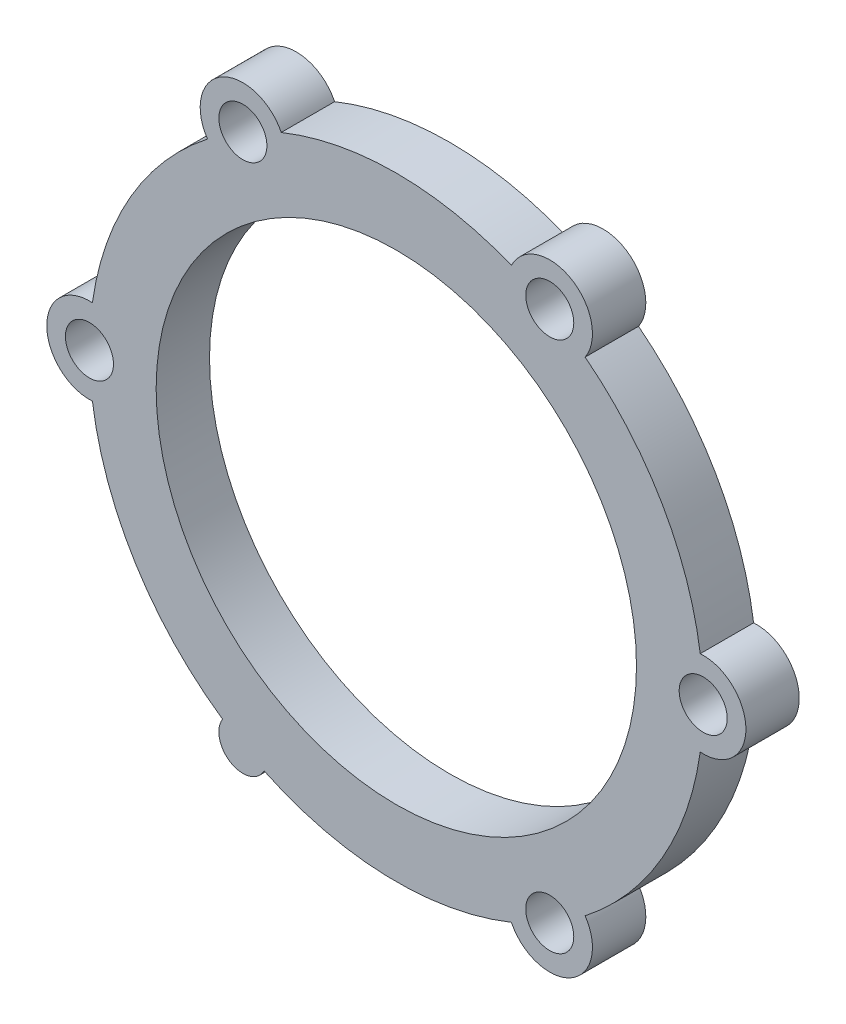
ISO-10303-21;
HEADER;
FILE_DESCRIPTION(('STEP AP214'),'2;1');
FILE_NAME('part.step','',(''),(''),'','','');
FILE_SCHEMA(('AUTOMOTIVE_DESIGN { 1 0 10303 214 1 1 1 1 }'));
ENDSEC;
DATA;
#1=APPLICATION_CONTEXT('core data for automotive mechanical design processes');
#2=APPLICATION_PROTOCOL_DEFINITION('international standard','automotive_design',2000,#1);
#3=PRODUCT_CONTEXT('',#1,'mechanical');
#4=PRODUCT('Part','Part','',(#3));
#5=PRODUCT_RELATED_PRODUCT_CATEGORY('part','',(#4));
#6=PRODUCT_DEFINITION_FORMATION('','',#4);
#7=PRODUCT_DEFINITION_CONTEXT('part definition',#1,'design');
#8=PRODUCT_DEFINITION('design','',#6,#7);
#9=PRODUCT_DEFINITION_SHAPE('','',#8);
#10=(LENGTH_UNIT() NAMED_UNIT(*) SI_UNIT(.MILLI.,.METRE.));
#11=(NAMED_UNIT(*) PLANE_ANGLE_UNIT() SI_UNIT($,.RADIAN.));
#12=(NAMED_UNIT(*) SI_UNIT($,.STERADIAN.) SOLID_ANGLE_UNIT());
#13=UNCERTAINTY_MEASURE_WITH_UNIT(LENGTH_MEASURE(1.E-05),#10,'distance_accuracy_value','');
#14=(GEOMETRIC_REPRESENTATION_CONTEXT(3) GLOBAL_UNCERTAINTY_ASSIGNED_CONTEXT((#13)) GLOBAL_UNIT_ASSIGNED_CONTEXT((#10,
#11,#12)) REPRESENTATION_CONTEXT('',''));
#15=CARTESIAN_POINT('',(0.,0.,0.));
#16=DIRECTION('',(0.,0.,1.));
#17=DIRECTION('',(1.,0.,0.));
#18=AXIS2_PLACEMENT_3D('',#15,#16,#17);
#19=CARTESIAN_POINT('',(0.,0.,10.));
#20=DIRECTION('',(0.,0.,-1.));
#21=DIRECTION('',(-1.,0.,0.));
#22=AXIS2_PLACEMENT_3D('',#19,#20,#21);
#23=CYLINDRICAL_SURFACE('',#22,45.);
#24=CARTESIAN_POINT('',(0.,0.,10.));
#25=DIRECTION('',(0.,0.,1.));
#26=DIRECTION('',(1.,0.,0.));
#27=AXIS2_PLACEMENT_3D('',#24,#25,#26);
#28=CIRCLE('',#27,45.);
#29=CARTESIAN_POINT('',(45.,0.,10.));
#30=VERTEX_POINT('',#29);
#31=EDGE_CURVE('E229',#30,#30,#28,.T.);
#32=ORIENTED_EDGE('',*,*,#31,.T.);
#33=EDGE_LOOP('',(#32));
#34=FACE_BOUND('',#33,.T.);
#35=CARTESIAN_POINT('',(0.,0.,0.));
#36=DIRECTION('',(0.,0.,1.));
#37=DIRECTION('',(1.,0.,0.));
#38=AXIS2_PLACEMENT_3D('',#35,#36,#37);
#39=CIRCLE('',#38,45.);
#40=CARTESIAN_POINT('',(45.,0.,0.));
#41=VERTEX_POINT('',#40);
#42=EDGE_CURVE('E214',#41,#41,#39,.T.);
#43=ORIENTED_EDGE('',*,*,#42,.F.);
#44=EDGE_LOOP('',(#43));
#45=FACE_BOUND('',#44,.T.);
#46=ADVANCED_FACE('F76',(#34,#45),#23,.F.);
#47=CARTESIAN_POINT('',(-57.5,0.,10.));
#48=DIRECTION('',(0.,0.,-1.));
#49=DIRECTION('',(-1.,0.,0.));
#50=AXIS2_PLACEMENT_3D('',#47,#48,#49);
#51=CYLINDRICAL_SURFACE('',#50,4.50000000000001);
#52=CARTESIAN_POINT('',(-57.5,0.,10.));
#53=DIRECTION('',(0.,0.,1.));
#54=DIRECTION('',(1.,0.,0.));
#55=AXIS2_PLACEMENT_3D('',#52,#53,#54);
#56=CIRCLE('',#55,4.50000000000001);
#57=CARTESIAN_POINT('',(-53.,0.,10.));
#58=VERTEX_POINT('',#57);
#59=EDGE_CURVE('E559',#58,#58,#56,.T.);
#60=ORIENTED_EDGE('',*,*,#59,.T.);
#61=EDGE_LOOP('',(#60));
#62=FACE_BOUND('',#61,.T.);
#63=CARTESIAN_POINT('',(-57.5,0.,0.));
#64=DIRECTION('',(0.,0.,1.));
#65=DIRECTION('',(1.,0.,0.));
#66=AXIS2_PLACEMENT_3D('',#63,#64,#65);
#67=CIRCLE('',#66,4.50000000000001);
#68=CARTESIAN_POINT('',(-53.,0.,0.));
#69=VERTEX_POINT('',#68);
#70=EDGE_CURVE('E219',#69,#69,#67,.T.);
#71=ORIENTED_EDGE('',*,*,#70,.F.);
#72=EDGE_LOOP('',(#71));
#73=FACE_BOUND('',#72,.T.);
#74=ADVANCED_FACE('F294',(#62,#73),#51,.F.);
#75=CARTESIAN_POINT('',(28.75,49.7964607176052,10.));
#76=DIRECTION('',(0.,0.,-1.));
#77=DIRECTION('',(-1.,0.,0.));
#78=AXIS2_PLACEMENT_3D('',#75,#76,#77);
#79=CYLINDRICAL_SURFACE('',#78,4.50000000000008);
#80=CARTESIAN_POINT('',(28.75,49.7964607176052,10.));
#81=DIRECTION('',(0.,0.,1.));
#82=DIRECTION('',(1.,0.,0.));
#83=AXIS2_PLACEMENT_3D('',#80,#81,#82);
#84=CIRCLE('',#83,4.50000000000008);
#85=CARTESIAN_POINT('',(33.2500000000001,49.7964607176052,10.));
#86=VERTEX_POINT('',#85);
#87=EDGE_CURVE('E554',#86,#86,#84,.T.);
#88=ORIENTED_EDGE('',*,*,#87,.T.);
#89=EDGE_LOOP('',(#88));
#90=FACE_BOUND('',#89,.T.);
#91=CARTESIAN_POINT('',(28.75,49.7964607176052,0.));
#92=DIRECTION('',(0.,0.,1.));
#93=DIRECTION('',(1.,0.,0.));
#94=AXIS2_PLACEMENT_3D('',#91,#92,#93);
#95=CIRCLE('',#94,4.50000000000008);
#96=CARTESIAN_POINT('',(33.2500000000001,49.7964607176052,0.));
#97=VERTEX_POINT('',#96);
#98=EDGE_CURVE('E222',#97,#97,#95,.T.);
#99=ORIENTED_EDGE('',*,*,#98,.F.);
#100=EDGE_LOOP('',(#99));
#101=FACE_BOUND('',#100,.T.);
#102=ADVANCED_FACE('F292',(#90,#101),#79,.F.);
#103=CARTESIAN_POINT('',(-28.75,49.7964607176052,10.));
#104=DIRECTION('',(0.,0.,-1.));
#105=DIRECTION('',(-1.,0.,0.));
#106=AXIS2_PLACEMENT_3D('',#103,#104,#105);
#107=CYLINDRICAL_SURFACE('',#106,4.50000000000004);
#108=CARTESIAN_POINT('',(-28.75,49.7964607176052,10.));
#109=DIRECTION('',(0.,0.,1.));
#110=DIRECTION('',(1.,0.,0.));
#111=AXIS2_PLACEMENT_3D('',#108,#109,#110);
#112=CIRCLE('',#111,4.50000000000004);
#113=CARTESIAN_POINT('',(-24.25,49.7964607176052,10.));
#114=VERTEX_POINT('',#113);
#115=EDGE_CURVE('E549',#114,#114,#112,.T.);
#116=ORIENTED_EDGE('',*,*,#115,.T.);
#117=EDGE_LOOP('',(#116));
#118=FACE_BOUND('',#117,.T.);
#119=CARTESIAN_POINT('',(-28.75,49.7964607176052,0.));
#120=DIRECTION('',(0.,0.,1.));
#121=DIRECTION('',(1.,0.,0.));
#122=AXIS2_PLACEMENT_3D('',#119,#120,#121);
#123=CIRCLE('',#122,4.50000000000004);
#124=CARTESIAN_POINT('',(-24.25,49.7964607176052,0.));
#125=VERTEX_POINT('',#124);
#126=EDGE_CURVE('E281',#125,#125,#123,.T.);
#127=ORIENTED_EDGE('',*,*,#126,.F.);
#128=EDGE_LOOP('',(#127));
#129=FACE_BOUND('',#128,.T.);
#130=ADVANCED_FACE('F291',(#118,#129),#107,.F.);
#131=CARTESIAN_POINT('',(57.5,-4.0152035396696E-13,10.));
#132=DIRECTION('',(0.,0.,-1.));
#133=DIRECTION('',(-1.,0.,0.));
#134=AXIS2_PLACEMENT_3D('',#131,#132,#133);
#135=CYLINDRICAL_SURFACE('',#134,4.5);
#136=CARTESIAN_POINT('',(57.5,-4.0152035396696E-13,10.));
#137=DIRECTION('',(0.,0.,1.));
#138=DIRECTION('',(1.,0.,0.));
#139=AXIS2_PLACEMENT_3D('',#136,#137,#138);
#140=CIRCLE('',#139,4.5);
#141=CARTESIAN_POINT('',(62.,-4.0152035396696E-13,10.));
#142=VERTEX_POINT('',#141);
#143=EDGE_CURVE('E543',#142,#142,#140,.T.);
#144=ORIENTED_EDGE('',*,*,#143,.T.);
#145=EDGE_LOOP('',(#144));
#146=FACE_BOUND('',#145,.T.);
#147=CARTESIAN_POINT('',(57.5,-4.0152035396696E-13,0.));
#148=DIRECTION('',(0.,0.,1.));
#149=DIRECTION('',(1.,0.,0.));
#150=AXIS2_PLACEMENT_3D('',#147,#148,#149);
#151=CIRCLE('',#150,4.5);
#152=CARTESIAN_POINT('',(62.,-4.0152035396696E-13,0.));
#153=VERTEX_POINT('',#152);
#154=EDGE_CURVE('E282',#153,#153,#151,.T.);
#155=ORIENTED_EDGE('',*,*,#154,.F.);
#156=EDGE_LOOP('',(#155));
#157=FACE_BOUND('',#156,.T.);
#158=ADVANCED_FACE('F303',(#146,#157),#135,.F.);
#159=CARTESIAN_POINT('',(28.7499999999995,-49.7964607176055,10.));
#160=DIRECTION('',(0.,0.,-1.));
#161=DIRECTION('',(-1.,0.,0.));
#162=AXIS2_PLACEMENT_3D('',#159,#160,#161);
#163=CYLINDRICAL_SURFACE('',#162,4.5);
#164=CARTESIAN_POINT('',(28.7499999999995,-49.7964607176055,10.));
#165=DIRECTION('',(0.,0.,1.));
#166=DIRECTION('',(1.,0.,0.));
#167=AXIS2_PLACEMENT_3D('',#164,#165,#166);
#168=CIRCLE('',#167,4.5);
#169=CARTESIAN_POINT('',(33.2499999999995,-49.7964607176055,10.));
#170=VERTEX_POINT('',#169);
#171=EDGE_CURVE('E200',#170,#170,#168,.T.);
#172=ORIENTED_EDGE('',*,*,#171,.T.);
#173=EDGE_LOOP('',(#172));
#174=FACE_BOUND('',#173,.T.);
#175=CARTESIAN_POINT('',(28.7499999999995,-49.7964607176055,0.));
#176=DIRECTION('',(0.,0.,1.));
#177=DIRECTION('',(1.,0.,0.));
#178=AXIS2_PLACEMENT_3D('',#175,#176,#177);
#179=CIRCLE('',#178,4.5);
#180=CARTESIAN_POINT('',(33.2499999999995,-49.7964607176055,0.));
#181=VERTEX_POINT('',#180);
#182=EDGE_CURVE('E277',#181,#181,#179,.T.);
#183=ORIENTED_EDGE('',*,*,#182,.F.);
#184=EDGE_LOOP('',(#183));
#185=FACE_BOUND('',#184,.T.);
#186=ADVANCED_FACE('F458',(#174,#185),#163,.F.);
#187=CARTESIAN_POINT('',(0.,0.,10.));
#188=DIRECTION('',(0.,0.,-1.));
#189=DIRECTION('',(-1.,0.,0.));
#190=AXIS2_PLACEMENT_3D('',#187,#188,#189);
#191=CYLINDRICAL_SURFACE('',#190,57.5);
#192=CARTESIAN_POINT('',(0.,0.,0.));
#193=DIRECTION('',(0.,0.,1.));
#194=DIRECTION('',(1.,0.,0.));
#195=AXIS2_PLACEMENT_3D('',#192,#193,#194);
#196=CIRCLE('',#195,57.5);
#197=CARTESIAN_POINT('',(35.383158135632,-45.3241891306272,0.));
#198=VERTEX_POINT('',#197);
#199=CARTESIAN_POINT('',(56.9434782608695,-7.98061924626664,0.));
#200=VERTEX_POINT('',#199);
#201=EDGE_CURVE('E261',#198,#200,#196,.T.);
#202=ORIENTED_EDGE('',*,*,#201,.T.);
#203=DIRECTION('',(0.,0.,-1.));
#204=VECTOR('',#203,1.);
#205=CARTESIAN_POINT('',(56.9434782608695,-7.98061924626664,10.));
#206=LINE('',#205,#204);
#207=CARTESIAN_POINT('',(56.9434782608695,-7.98061924626664,10.));
#208=VERTEX_POINT('',#207);
#209=EDGE_CURVE('E88',#208,#200,#206,.T.);
#210=ORIENTED_EDGE('',*,*,#209,.F.);
#211=CARTESIAN_POINT('',(0.,0.,10.));
#212=DIRECTION('',(0.,0.,1.));
#213=DIRECTION('',(1.,0.,0.));
#214=AXIS2_PLACEMENT_3D('',#211,#212,#213);
#215=CIRCLE('',#214,57.5);
#216=CARTESIAN_POINT('',(35.383158135632,-45.3241891306272,10.));
#217=VERTEX_POINT('',#216);
#218=EDGE_CURVE('E146',#217,#208,#215,.T.);
#219=ORIENTED_EDGE('',*,*,#218,.F.);
#220=DIRECTION('',(0.,0.,-1.));
#221=VECTOR('',#220,1.);
#222=CARTESIAN_POINT('',(35.383158135632,-45.3241891306272,10.));
#223=LINE('',#222,#221);
#224=EDGE_CURVE('E12',#217,#198,#223,.T.);
#225=ORIENTED_EDGE('',*,*,#224,.T.);
#226=EDGE_LOOP('',(#202,#210,#219,#225));
#227=FACE_BOUND('',#226,.T.);
#228=ADVANCED_FACE('F386',(#227),#191,.T.);
#229=CARTESIAN_POINT('',(57.5,-4.0152035396696E-13,10.));
#230=DIRECTION('',(0.,0.,-1.));
#231=DIRECTION('',(-1.,0.,0.));
#232=AXIS2_PLACEMENT_3D('',#229,#230,#231);
#233=CYLINDRICAL_SURFACE('',#232,7.99999999999999);
#234=CARTESIAN_POINT('',(57.5,-4.0152035396696E-13,0.));
#235=DIRECTION('',(0.,0.,1.));
#236=DIRECTION('',(1.,0.,0.));
#237=AXIS2_PLACEMENT_3D('',#234,#235,#236);
#238=CIRCLE('',#237,7.99999999999999);
#239=CARTESIAN_POINT('',(56.9434782608696,7.98061924626585,0.));
#240=VERTEX_POINT('',#239);
#241=EDGE_CURVE('E257',#200,#240,#238,.T.);
#242=ORIENTED_EDGE('',*,*,#241,.T.);
#243=DIRECTION('',(0.,0.,-1.));
#244=VECTOR('',#243,1.);
#245=CARTESIAN_POINT('',(56.9434782608696,7.98061924626585,10.));
#246=LINE('',#245,#244);
#247=CARTESIAN_POINT('',(56.9434782608696,7.98061924626585,10.));
#248=VERTEX_POINT('',#247);
#249=EDGE_CURVE('E246',#248,#240,#246,.T.);
#250=ORIENTED_EDGE('',*,*,#249,.F.);
#251=CARTESIAN_POINT('',(57.5,-4.0152035396696E-13,10.));
#252=DIRECTION('',(0.,0.,1.));
#253=DIRECTION('',(1.,0.,0.));
#254=AXIS2_PLACEMENT_3D('',#251,#252,#253);
#255=CIRCLE('',#254,7.99999999999999);
#256=EDGE_CURVE('E213',#208,#248,#255,.T.);
#257=ORIENTED_EDGE('',*,*,#256,.F.);
#258=ORIENTED_EDGE('',*,*,#209,.T.);
#259=EDGE_LOOP('',(#242,#250,#257,#258));
#260=FACE_BOUND('',#259,.T.);
#261=ADVANCED_FACE('F252',(#260),#233,.T.);
#262=CARTESIAN_POINT('',(35.3831581356324,45.3241891306268,0.));
#263=VERTEX_POINT('',#262);
#264=EDGE_CURVE('E262',#240,#263,#196,.T.);
#265=ORIENTED_EDGE('',*,*,#264,.T.);
#266=DIRECTION('',(0.,0.,-1.));
#267=VECTOR('',#266,1.);
#268=CARTESIAN_POINT('',(35.3831581356324,45.3241891306268,10.));
#269=LINE('',#268,#267);
#270=CARTESIAN_POINT('',(35.3831581356324,45.3241891306268,10.));
#271=VERTEX_POINT('',#270);
#272=EDGE_CURVE('E242',#271,#263,#269,.T.);
#273=ORIENTED_EDGE('',*,*,#272,.F.);
#274=EDGE_CURVE('E210',#248,#271,#215,.T.);
#275=ORIENTED_EDGE('',*,*,#274,.F.);
#276=ORIENTED_EDGE('',*,*,#249,.T.);
#277=EDGE_LOOP('',(#265,#273,#275,#276));
#278=FACE_BOUND('',#277,.T.);
#279=ADVANCED_FACE('F428',(#278),#191,.T.);
#280=CARTESIAN_POINT('',(28.75,49.7964607176052,10.));
#281=DIRECTION('',(0.,0.,-1.));
#282=DIRECTION('',(-1.,0.,0.));
#283=AXIS2_PLACEMENT_3D('',#280,#281,#282);
#284=CYLINDRICAL_SURFACE('',#283,8.00000000000007);
#285=CARTESIAN_POINT('',(28.75,49.7964607176052,0.));
#286=DIRECTION('',(0.,0.,1.));
#287=DIRECTION('',(1.,0.,0.));
#288=AXIS2_PLACEMENT_3D('',#285,#286,#287);
#289=CIRCLE('',#288,8.00000000000007);
#290=CARTESIAN_POINT('',(21.5603201252371,53.3048083768931,0.));
#291=VERTEX_POINT('',#290);
#292=EDGE_CURVE('E270',#263,#291,#289,.T.);
#293=ORIENTED_EDGE('',*,*,#292,.T.);
#294=DIRECTION('',(0.,0.,-1.));
#295=VECTOR('',#294,1.);
#296=CARTESIAN_POINT('',(21.5603201252371,53.3048083768931,10.));
#297=LINE('',#296,#295);
#298=CARTESIAN_POINT('',(21.5603201252371,53.3048083768931,10.));
#299=VERTEX_POINT('',#298);
#300=EDGE_CURVE('E245',#299,#291,#297,.T.);
#301=ORIENTED_EDGE('',*,*,#300,.F.);
#302=CARTESIAN_POINT('',(28.75,49.7964607176052,10.));
#303=DIRECTION('',(0.,0.,1.));
#304=DIRECTION('',(1.,0.,0.));
#305=AXIS2_PLACEMENT_3D('',#302,#303,#304);
#306=CIRCLE('',#305,8.00000000000007);
#307=EDGE_CURVE('E208',#271,#299,#306,.T.);
#308=ORIENTED_EDGE('',*,*,#307,.F.);
#309=ORIENTED_EDGE('',*,*,#272,.T.);
#310=EDGE_LOOP('',(#293,#301,#308,#309));
#311=FACE_BOUND('',#310,.T.);
#312=ADVANCED_FACE('F426',(#311),#284,.T.);
#313=CARTESIAN_POINT('',(-21.5603201252372,53.3048083768931,0.));
#314=VERTEX_POINT('',#313);
#315=EDGE_CURVE('E267',#291,#314,#196,.T.);
#316=ORIENTED_EDGE('',*,*,#315,.T.);
#317=DIRECTION('',(0.,0.,-1.));
#318=VECTOR('',#317,1.);
#319=CARTESIAN_POINT('',(-21.5603201252372,53.3048083768931,10.));
#320=LINE('',#319,#318);
#321=CARTESIAN_POINT('',(-21.5603201252372,53.3048083768931,10.));
#322=VERTEX_POINT('',#321);
#323=EDGE_CURVE('E236',#322,#314,#320,.T.);
#324=ORIENTED_EDGE('',*,*,#323,.F.);
#325=EDGE_CURVE('E205',#299,#322,#215,.T.);
#326=ORIENTED_EDGE('',*,*,#325,.F.);
#327=ORIENTED_EDGE('',*,*,#300,.T.);
#328=EDGE_LOOP('',(#316,#324,#326,#327));
#329=FACE_BOUND('',#328,.T.);
#330=ADVANCED_FACE('F412',(#329),#191,.T.);
#331=CARTESIAN_POINT('',(-28.75,49.7964607176052,10.));
#332=DIRECTION('',(0.,0.,-1.));
#333=DIRECTION('',(-1.,0.,0.));
#334=AXIS2_PLACEMENT_3D('',#331,#332,#333);
#335=CYLINDRICAL_SURFACE('',#334,8.00000000000004);
#336=CARTESIAN_POINT('',(-28.75,49.7964607176052,0.));
#337=DIRECTION('',(0.,0.,1.));
#338=DIRECTION('',(1.,0.,0.));
#339=AXIS2_PLACEMENT_3D('',#336,#337,#338);
#340=CIRCLE('',#339,8.00000000000004);
#341=CARTESIAN_POINT('',(-35.3831581356324,45.3241891306268,0.));
#342=VERTEX_POINT('',#341);
#343=EDGE_CURVE('E273',#314,#342,#340,.T.);
#344=ORIENTED_EDGE('',*,*,#343,.T.);
#345=DIRECTION('',(0.,0.,-1.));
#346=VECTOR('',#345,1.);
#347=CARTESIAN_POINT('',(-35.3831581356324,45.3241891306268,10.));
#348=LINE('',#347,#346);
#349=CARTESIAN_POINT('',(-35.3831581356324,45.3241891306268,10.));
#350=VERTEX_POINT('',#349);
#351=EDGE_CURVE('E237',#350,#342,#348,.T.);
#352=ORIENTED_EDGE('',*,*,#351,.F.);
#353=CARTESIAN_POINT('',(-28.75,49.7964607176052,10.));
#354=DIRECTION('',(0.,0.,1.));
#355=DIRECTION('',(1.,0.,0.));
#356=AXIS2_PLACEMENT_3D('',#353,#354,#355);
#357=CIRCLE('',#356,8.00000000000004);
#358=EDGE_CURVE('E202',#322,#350,#357,.T.);
#359=ORIENTED_EDGE('',*,*,#358,.F.);
#360=ORIENTED_EDGE('',*,*,#323,.T.);
#361=EDGE_LOOP('',(#344,#352,#359,#360));
#362=FACE_BOUND('',#361,.T.);
#363=ADVANCED_FACE('F411',(#362),#335,.T.);
#364=CARTESIAN_POINT('',(-56.9434782608696,7.98061924626624,0.));
#365=VERTEX_POINT('',#364);
#366=EDGE_CURVE('E274',#342,#365,#196,.T.);
#367=ORIENTED_EDGE('',*,*,#366,.T.);
#368=DIRECTION('',(0.,0.,-1.));
#369=VECTOR('',#368,1.);
#370=CARTESIAN_POINT('',(-56.9434782608696,7.98061924626624,10.));
#371=LINE('',#370,#369);
#372=CARTESIAN_POINT('',(-56.9434782608696,7.98061924626624,10.));
#373=VERTEX_POINT('',#372);
#374=EDGE_CURVE('E232',#373,#365,#371,.T.);
#375=ORIENTED_EDGE('',*,*,#374,.F.);
#376=EDGE_CURVE('E198',#350,#373,#215,.T.);
#377=ORIENTED_EDGE('',*,*,#376,.F.);
#378=ORIENTED_EDGE('',*,*,#351,.T.);
#379=EDGE_LOOP('',(#367,#375,#377,#378));
#380=FACE_BOUND('',#379,.T.);
#381=ADVANCED_FACE('F398',(#380),#191,.T.);
#382=CARTESIAN_POINT('',(-57.5,0.,10.));
#383=DIRECTION('',(0.,0.,-1.));
#384=DIRECTION('',(-1.,0.,0.));
#385=AXIS2_PLACEMENT_3D('',#382,#383,#384);
#386=CYLINDRICAL_SURFACE('',#385,8.00000000000001);
#387=CARTESIAN_POINT('',(-57.5,0.,0.));
#388=DIRECTION('',(0.,0.,1.));
#389=DIRECTION('',(1.,0.,0.));
#390=AXIS2_PLACEMENT_3D('',#387,#388,#389);
#391=CIRCLE('',#390,8.00000000000001);
#392=CARTESIAN_POINT('',(-56.9434782608696,-7.98061924626624,0.));
#393=VERTEX_POINT('',#392);
#394=EDGE_CURVE('E276',#365,#393,#391,.T.);
#395=ORIENTED_EDGE('',*,*,#394,.T.);
#396=DIRECTION('',(0.,0.,-1.));
#397=VECTOR('',#396,1.);
#398=CARTESIAN_POINT('',(-56.9434782608696,-7.98061924626624,10.));
#399=LINE('',#398,#397);
#400=CARTESIAN_POINT('',(-56.9434782608696,-7.98061924626624,10.));
#401=VERTEX_POINT('',#400);
#402=EDGE_CURVE('E186',#401,#393,#399,.T.);
#403=ORIENTED_EDGE('',*,*,#402,.F.);
#404=CARTESIAN_POINT('',(-57.5,0.,10.));
#405=DIRECTION('',(0.,0.,1.));
#406=DIRECTION('',(1.,0.,0.));
#407=AXIS2_PLACEMENT_3D('',#404,#405,#406);
#408=CIRCLE('',#407,8.00000000000001);
#409=EDGE_CURVE('E194',#373,#401,#408,.T.);
#410=ORIENTED_EDGE('',*,*,#409,.F.);
#411=ORIENTED_EDGE('',*,*,#374,.T.);
#412=EDGE_LOOP('',(#395,#403,#410,#411));
#413=FACE_BOUND('',#412,.T.);
#414=ADVANCED_FACE('F394',(#413),#386,.T.);
#415=CARTESIAN_POINT('',(-32.5560860827333,-47.3956881896831,0.));
#416=VERTEX_POINT('',#415);
#417=EDGE_CURVE('E183',#393,#416,#196,.T.);
#418=ORIENTED_EDGE('',*,*,#417,.T.);
#419=DIRECTION('',(0.,0.,-1.));
#420=VECTOR('',#419,1.);
#421=CARTESIAN_POINT('',(-32.5560860827333,-47.3956881896831,10.));
#422=LINE('',#421,#420);
#423=CARTESIAN_POINT('',(-32.5560860827333,-47.3956881896831,10.));
#424=VERTEX_POINT('',#423);
#425=EDGE_CURVE('E176',#424,#416,#422,.T.);
#426=ORIENTED_EDGE('',*,*,#425,.F.);
#427=EDGE_CURVE('E181',#401,#424,#215,.T.);
#428=ORIENTED_EDGE('',*,*,#427,.F.);
#429=ORIENTED_EDGE('',*,*,#402,.T.);
#430=EDGE_LOOP('',(#418,#426,#428,#429));
#431=FACE_BOUND('',#430,.T.);
#432=ADVANCED_FACE('F178',(#431),#191,.T.);
#433=CARTESIAN_POINT('',(-24.7678269607449,-51.8922416902816,0.));
#434=VERTEX_POINT('',#433);
#435=CARTESIAN_POINT('',(21.5603201252367,-53.3048083768933,0.));
#436=VERTEX_POINT('',#435);
#437=EDGE_CURVE('E141',#434,#436,#196,.T.);
#438=ORIENTED_EDGE('',*,*,#437,.T.);
#439=DIRECTION('',(0.,0.,-1.));
#440=VECTOR('',#439,1.);
#441=CARTESIAN_POINT('',(21.5603201252367,-53.3048083768933,10.));
#442=LINE('',#441,#440);
#443=CARTESIAN_POINT('',(21.5603201252367,-53.3048083768933,10.));
#444=VERTEX_POINT('',#443);
#445=EDGE_CURVE('E228',#444,#436,#442,.T.);
#446=ORIENTED_EDGE('',*,*,#445,.F.);
#447=CARTESIAN_POINT('',(-24.7678269607449,-51.8922416902816,10.));
#448=VERTEX_POINT('',#447);
#449=EDGE_CURVE('E100',#448,#444,#215,.T.);
#450=ORIENTED_EDGE('',*,*,#449,.F.);
#451=DIRECTION('',(0.,0.,-1.));
#452=VECTOR('',#451,1.);
#453=CARTESIAN_POINT('',(-24.7678269607449,-51.8922416902816,10.));
#454=LINE('',#453,#452);
#455=EDGE_CURVE('E140',#448,#434,#454,.T.);
#456=ORIENTED_EDGE('',*,*,#455,.T.);
#457=EDGE_LOOP('',(#438,#446,#450,#456));
#458=FACE_BOUND('',#457,.T.);
#459=ADVANCED_FACE('F376',(#458),#191,.T.);
#460=CARTESIAN_POINT('',(28.7499999999995,-49.7964607176055,10.));
#461=DIRECTION('',(0.,0.,-1.));
#462=DIRECTION('',(-1.,0.,0.));
#463=AXIS2_PLACEMENT_3D('',#460,#461,#462);
#464=CYLINDRICAL_SURFACE('',#463,8.);
#465=CARTESIAN_POINT('',(28.7499999999995,-49.7964607176055,0.));
#466=DIRECTION('',(0.,0.,1.));
#467=DIRECTION('',(1.,0.,0.));
#468=AXIS2_PLACEMENT_3D('',#465,#466,#467);
#469=CIRCLE('',#468,8.);
#470=EDGE_CURVE('E188',#436,#198,#469,.T.);
#471=ORIENTED_EDGE('',*,*,#470,.T.);
#472=ORIENTED_EDGE('',*,*,#224,.F.);
#473=CARTESIAN_POINT('',(28.7499999999995,-49.7964607176055,10.));
#474=DIRECTION('',(0.,0.,1.));
#475=DIRECTION('',(1.,0.,0.));
#476=AXIS2_PLACEMENT_3D('',#473,#474,#475);
#477=CIRCLE('',#476,8.);
#478=EDGE_CURVE('E215',#444,#217,#477,.T.);
#479=ORIENTED_EDGE('',*,*,#478,.F.);
#480=ORIENTED_EDGE('',*,*,#445,.T.);
#481=EDGE_LOOP('',(#471,#472,#479,#480));
#482=FACE_BOUND('',#481,.T.);
#483=ADVANCED_FACE('F320',(#482),#464,.T.);
#484=CARTESIAN_POINT('',(0.,0.,0.));
#485=DIRECTION('',(0.,0.,1.));
#486=DIRECTION('',(1.,0.,0.));
#487=AXIS2_PLACEMENT_3D('',#484,#485,#486);
#488=PLANE('',#487);
#489=ORIENTED_EDGE('',*,*,#470,.F.);
#490=ORIENTED_EDGE('',*,*,#437,.F.);
#491=CARTESIAN_POINT('',(-28.75,-49.7964607176053,0.));
#492=DIRECTION('',(0.,0.,1.));
#493=DIRECTION('',(1.,0.,0.));
#494=AXIS2_PLACEMENT_3D('',#491,#492,#493);
#495=CIRCLE('',#494,4.50000000000022);
#496=EDGE_CURVE('E85',#416,#434,#495,.T.);
#497=ORIENTED_EDGE('',*,*,#496,.F.);
#498=ORIENTED_EDGE('',*,*,#417,.F.);
#499=ORIENTED_EDGE('',*,*,#394,.F.);
#500=ORIENTED_EDGE('',*,*,#366,.F.);
#501=ORIENTED_EDGE('',*,*,#343,.F.);
#502=ORIENTED_EDGE('',*,*,#315,.F.);
#503=ORIENTED_EDGE('',*,*,#292,.F.);
#504=ORIENTED_EDGE('',*,*,#264,.F.);
#505=ORIENTED_EDGE('',*,*,#241,.F.);
#506=ORIENTED_EDGE('',*,*,#201,.F.);
#507=EDGE_LOOP('',(#489,#490,#497,#498,#499,#500,#501,#502,#503,#504,#505,#506));
#508=FACE_BOUND('',#507,.T.);
#509=ORIENTED_EDGE('',*,*,#182,.T.);
#510=EDGE_LOOP('',(#509));
#511=FACE_BOUND('',#510,.T.);
#512=ORIENTED_EDGE('',*,*,#154,.T.);
#513=EDGE_LOOP('',(#512));
#514=FACE_BOUND('',#513,.T.);
#515=ORIENTED_EDGE('',*,*,#126,.T.);
#516=EDGE_LOOP('',(#515));
#517=FACE_BOUND('',#516,.T.);
#518=ORIENTED_EDGE('',*,*,#98,.T.);
#519=EDGE_LOOP('',(#518));
#520=FACE_BOUND('',#519,.T.);
#521=ORIENTED_EDGE('',*,*,#70,.T.);
#522=EDGE_LOOP('',(#521));
#523=FACE_BOUND('',#522,.T.);
#524=ORIENTED_EDGE('',*,*,#42,.T.);
#525=EDGE_LOOP('',(#524));
#526=FACE_BOUND('',#525,.T.);
#527=ADVANCED_FACE('F263',(#508,#511,#514,#517,#520,#523,#526),#488,.F.);
#528=CARTESIAN_POINT('',(0.,0.,10.));
#529=DIRECTION('',(0.,0.,1.));
#530=DIRECTION('',(1.,0.,0.));
#531=AXIS2_PLACEMENT_3D('',#528,#529,#530);
#532=PLANE('',#531);
#533=ORIENTED_EDGE('',*,*,#478,.T.);
#534=ORIENTED_EDGE('',*,*,#218,.T.);
#535=ORIENTED_EDGE('',*,*,#256,.T.);
#536=ORIENTED_EDGE('',*,*,#274,.T.);
#537=ORIENTED_EDGE('',*,*,#307,.T.);
#538=ORIENTED_EDGE('',*,*,#325,.T.);
#539=ORIENTED_EDGE('',*,*,#358,.T.);
#540=ORIENTED_EDGE('',*,*,#376,.T.);
#541=ORIENTED_EDGE('',*,*,#409,.T.);
#542=ORIENTED_EDGE('',*,*,#427,.T.);
#543=CARTESIAN_POINT('',(-28.75,-49.7964607176053,10.));
#544=DIRECTION('',(0.,0.,1.));
#545=DIRECTION('',(1.,0.,0.));
#546=AXIS2_PLACEMENT_3D('',#543,#544,#545);
#547=CIRCLE('',#546,4.50000000000022);
#548=EDGE_CURVE('E187',#424,#448,#547,.T.);
#549=ORIENTED_EDGE('',*,*,#548,.T.);
#550=ORIENTED_EDGE('',*,*,#449,.T.);
#551=EDGE_LOOP('',(#533,#534,#535,#536,#537,#538,#539,#540,#541,#542,#549,#550));
#552=FACE_BOUND('',#551,.T.);
#553=ORIENTED_EDGE('',*,*,#171,.F.);
#554=EDGE_LOOP('',(#553));
#555=FACE_BOUND('',#554,.T.);
#556=ORIENTED_EDGE('',*,*,#143,.F.);
#557=EDGE_LOOP('',(#556));
#558=FACE_BOUND('',#557,.T.);
#559=ORIENTED_EDGE('',*,*,#115,.F.);
#560=EDGE_LOOP('',(#559));
#561=FACE_BOUND('',#560,.T.);
#562=ORIENTED_EDGE('',*,*,#87,.F.);
#563=EDGE_LOOP('',(#562));
#564=FACE_BOUND('',#563,.T.);
#565=ORIENTED_EDGE('',*,*,#59,.F.);
#566=EDGE_LOOP('',(#565));
#567=FACE_BOUND('',#566,.T.);
#568=ORIENTED_EDGE('',*,*,#31,.F.);
#569=EDGE_LOOP('',(#568));
#570=FACE_BOUND('',#569,.T.);
#571=ADVANCED_FACE('F189',(#552,#555,#558,#561,#564,#567,#570),#532,.T.);
#572=CARTESIAN_POINT('',(-28.75,-49.7964607176053,10.));
#573=DIRECTION('',(0.,0.,-1.));
#574=DIRECTION('',(-1.,0.,0.));
#575=AXIS2_PLACEMENT_3D('',#572,#573,#574);
#576=CYLINDRICAL_SURFACE('',#575,4.50000000000022);
#577=ORIENTED_EDGE('',*,*,#548,.F.);
#578=ORIENTED_EDGE('',*,*,#425,.T.);
#579=ORIENTED_EDGE('',*,*,#496,.T.);
#580=ORIENTED_EDGE('',*,*,#455,.F.);
#581=EDGE_LOOP('',(#577,#578,#579,#580));
#582=FACE_BOUND('',#581,.T.);
#583=ADVANCED_FACE('F79',(#582),#576,.T.);
#584=CLOSED_SHELL('',(#46,#74,#102,#130,#158,#186,#228,#261,#279,#312,#330,#363,#381,#414,#432,
#459,#483,#527,#571,#583));
#585=MANIFOLD_SOLID_BREP('B2',#584);
#586=ADVANCED_BREP_SHAPE_REPRESENTATION('',(#18,#585),#14);
#587=SHAPE_DEFINITION_REPRESENTATION(#9,#586);
ENDSEC;
END-ISO-10303-21;
